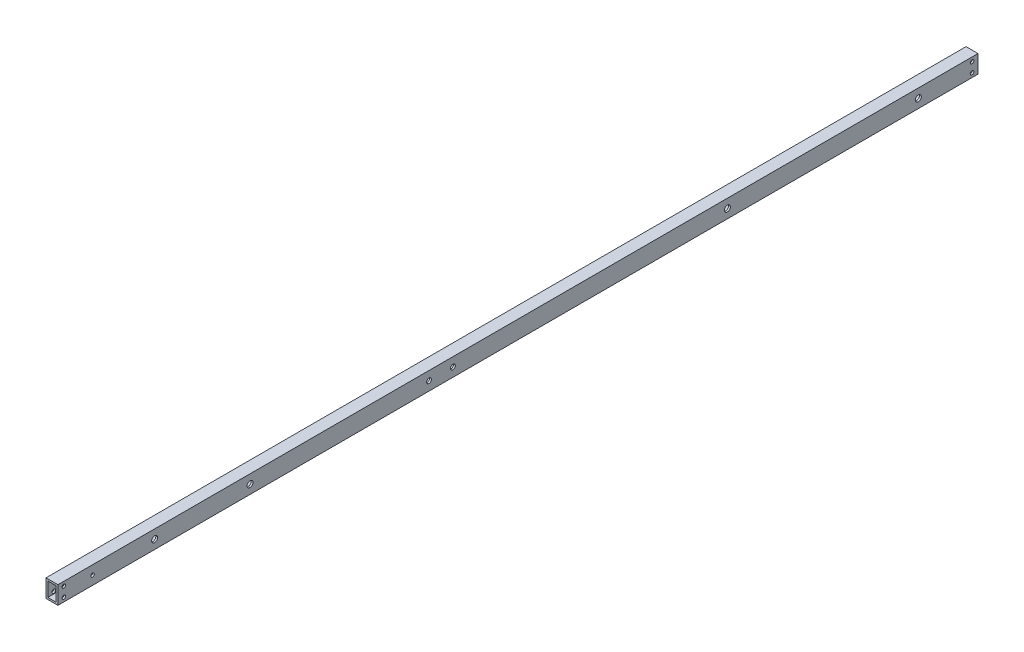
ISO-10303-21;
HEADER;
FILE_DESCRIPTION(('STEP AP214'),'2;1');
FILE_NAME('part.step','',(''),(''),'','','');
FILE_SCHEMA(('AUTOMOTIVE_DESIGN { 1 0 10303 214 1 1 1 1 }'));
ENDSEC;
DATA;
#1=APPLICATION_CONTEXT('core data for automotive mechanical design processes');
#2=APPLICATION_PROTOCOL_DEFINITION('international standard','automotive_design',2000,#1);
#3=PRODUCT_CONTEXT('',#1,'mechanical');
#4=PRODUCT('Part','Part','',(#3));
#5=PRODUCT_RELATED_PRODUCT_CATEGORY('part','',(#4));
#6=PRODUCT_DEFINITION_FORMATION('','',#4);
#7=PRODUCT_DEFINITION_CONTEXT('part definition',#1,'design');
#8=PRODUCT_DEFINITION('design','',#6,#7);
#9=PRODUCT_DEFINITION_SHAPE('','',#8);
#10=(LENGTH_UNIT() NAMED_UNIT(*) SI_UNIT(.MILLI.,.METRE.));
#11=(NAMED_UNIT(*) PLANE_ANGLE_UNIT() SI_UNIT($,.RADIAN.));
#12=(NAMED_UNIT(*) SI_UNIT($,.STERADIAN.) SOLID_ANGLE_UNIT());
#13=UNCERTAINTY_MEASURE_WITH_UNIT(LENGTH_MEASURE(1.E-05),#10,'distance_accuracy_value','');
#14=(GEOMETRIC_REPRESENTATION_CONTEXT(3) GLOBAL_UNCERTAINTY_ASSIGNED_CONTEXT((#13)) GLOBAL_UNIT_ASSIGNED_CONTEXT((#10,
#11,#12)) REPRESENTATION_CONTEXT('',''));
#15=CARTESIAN_POINT('',(0.,0.,0.));
#16=DIRECTION('',(0.,0.,1.));
#17=DIRECTION('',(1.,0.,0.));
#18=AXIS2_PLACEMENT_3D('',#15,#16,#17);
#19=CARTESIAN_POINT('',(0.,0.,771.));
#20=DIRECTION('',(0.,0.,1.));
#21=DIRECTION('',(1.,0.,0.));
#22=AXIS2_PLACEMENT_3D('',#19,#20,#21);
#23=PLANE('',#22);
#24=DIRECTION('',(0.,1.,0.));
#25=VECTOR('',#24,1.);
#26=CARTESIAN_POINT('',(5.,-7.5,771.));
#27=LINE('',#26,#25);
#28=CARTESIAN_POINT('',(5.,-7.5,771.));
#29=VERTEX_POINT('',#28);
#30=CARTESIAN_POINT('',(5.,7.5,771.));
#31=VERTEX_POINT('',#30);
#32=EDGE_CURVE('E181',#29,#31,#27,.T.);
#33=ORIENTED_EDGE('',*,*,#32,.T.);
#34=DIRECTION('',(-1.,0.,0.));
#35=VECTOR('',#34,1.);
#36=CARTESIAN_POINT('',(-5.,7.5,771.));
#37=LINE('',#36,#35);
#38=CARTESIAN_POINT('',(-5.,7.5,771.));
#39=VERTEX_POINT('',#38);
#40=EDGE_CURVE('E185',#31,#39,#37,.T.);
#41=ORIENTED_EDGE('',*,*,#40,.T.);
#42=DIRECTION('',(0.,-1.,0.));
#43=VECTOR('',#42,1.);
#44=CARTESIAN_POINT('',(-5.,-7.5,771.));
#45=LINE('',#44,#43);
#46=CARTESIAN_POINT('',(-5.,-7.5,771.));
#47=VERTEX_POINT('',#46);
#48=EDGE_CURVE('E189',#39,#47,#45,.T.);
#49=ORIENTED_EDGE('',*,*,#48,.T.);
#50=DIRECTION('',(1.,0.,0.));
#51=VECTOR('',#50,1.);
#52=CARTESIAN_POINT('',(-5.,-7.5,771.));
#53=LINE('',#52,#51);
#54=EDGE_CURVE('E192',#47,#29,#53,.T.);
#55=ORIENTED_EDGE('',*,*,#54,.T.);
#56=EDGE_LOOP('',(#33,#41,#49,#55));
#57=FACE_BOUND('',#56,.T.);
#58=DIRECTION('',(-1.,0.,0.));
#59=VECTOR('',#58,1.);
#60=CARTESIAN_POINT('',(0.,6.,771.));
#61=LINE('',#60,#59);
#62=CARTESIAN_POINT('',(3.5,6.,771.));
#63=VERTEX_POINT('',#62);
#64=CARTESIAN_POINT('',(-3.5,6.,771.));
#65=VERTEX_POINT('',#64);
#66=EDGE_CURVE('E140',#63,#65,#61,.T.);
#67=ORIENTED_EDGE('',*,*,#66,.F.);
#68=DIRECTION('',(0.,1.,0.));
#69=VECTOR('',#68,1.);
#70=CARTESIAN_POINT('',(3.5,0.,771.));
#71=LINE('',#70,#69);
#72=CARTESIAN_POINT('',(3.5,-6.,771.));
#73=VERTEX_POINT('',#72);
#74=EDGE_CURVE('E131',#73,#63,#71,.T.);
#75=ORIENTED_EDGE('',*,*,#74,.F.);
#76=DIRECTION('',(1.,0.,0.));
#77=VECTOR('',#76,1.);
#78=CARTESIAN_POINT('',(0.,-6.,771.));
#79=LINE('',#78,#77);
#80=CARTESIAN_POINT('',(-3.5,-6.,771.));
#81=VERTEX_POINT('',#80);
#82=EDGE_CURVE('E157',#81,#73,#79,.T.);
#83=ORIENTED_EDGE('',*,*,#82,.F.);
#84=DIRECTION('',(0.,-1.,0.));
#85=VECTOR('',#84,1.);
#86=CARTESIAN_POINT('',(-3.5,0.,771.));
#87=LINE('',#86,#85);
#88=EDGE_CURVE('E153',#65,#81,#87,.T.);
#89=ORIENTED_EDGE('',*,*,#88,.F.);
#90=EDGE_LOOP('',(#67,#75,#83,#89));
#91=FACE_BOUND('',#90,.T.);
#92=ADVANCED_FACE('F63',(#57,#91),#23,.T.);
#93=CARTESIAN_POINT('',(0.,0.,0.));
#94=DIRECTION('',(0.,0.,1.));
#95=DIRECTION('',(1.,0.,0.));
#96=AXIS2_PLACEMENT_3D('',#93,#94,#95);
#97=PLANE('',#96);
#98=DIRECTION('',(0.,1.,0.));
#99=VECTOR('',#98,1.);
#100=CARTESIAN_POINT('',(5.,-7.5,0.));
#101=LINE('',#100,#99);
#102=CARTESIAN_POINT('',(5.,-7.5,0.));
#103=VERTEX_POINT('',#102);
#104=CARTESIAN_POINT('',(5.,7.5,0.));
#105=VERTEX_POINT('',#104);
#106=EDGE_CURVE('E149',#103,#105,#101,.T.);
#107=ORIENTED_EDGE('',*,*,#106,.F.);
#108=DIRECTION('',(1.,0.,0.));
#109=VECTOR('',#108,1.);
#110=CARTESIAN_POINT('',(-5.,-7.5,0.));
#111=LINE('',#110,#109);
#112=CARTESIAN_POINT('',(-5.,-7.5,0.));
#113=VERTEX_POINT('',#112);
#114=EDGE_CURVE('E186',#113,#103,#111,.T.);
#115=ORIENTED_EDGE('',*,*,#114,.F.);
#116=DIRECTION('',(0.,-1.,0.));
#117=VECTOR('',#116,1.);
#118=CARTESIAN_POINT('',(-5.,-7.5,0.));
#119=LINE('',#118,#117);
#120=CARTESIAN_POINT('',(-5.,7.5,0.));
#121=VERTEX_POINT('',#120);
#122=EDGE_CURVE('E202',#121,#113,#119,.T.);
#123=ORIENTED_EDGE('',*,*,#122,.F.);
#124=DIRECTION('',(-1.,0.,0.));
#125=VECTOR('',#124,1.);
#126=CARTESIAN_POINT('',(-5.,7.5,0.));
#127=LINE('',#126,#125);
#128=EDGE_CURVE('E199',#105,#121,#127,.T.);
#129=ORIENTED_EDGE('',*,*,#128,.F.);
#130=EDGE_LOOP('',(#107,#115,#123,#129));
#131=FACE_BOUND('',#130,.T.);
#132=DIRECTION('',(0.,1.,0.));
#133=VECTOR('',#132,1.);
#134=CARTESIAN_POINT('',(3.5,0.,0.));
#135=LINE('',#134,#133);
#136=CARTESIAN_POINT('',(3.5,-6.,0.));
#137=VERTEX_POINT('',#136);
#138=CARTESIAN_POINT('',(3.5,6.,0.));
#139=VERTEX_POINT('',#138);
#140=EDGE_CURVE('E89',#137,#139,#135,.T.);
#141=ORIENTED_EDGE('',*,*,#140,.T.);
#142=DIRECTION('',(-1.,0.,0.));
#143=VECTOR('',#142,1.);
#144=CARTESIAN_POINT('',(0.,6.,0.));
#145=LINE('',#144,#143);
#146=CARTESIAN_POINT('',(-3.5,6.,0.));
#147=VERTEX_POINT('',#146);
#148=EDGE_CURVE('E147',#139,#147,#145,.T.);
#149=ORIENTED_EDGE('',*,*,#148,.T.);
#150=DIRECTION('',(0.,-1.,0.));
#151=VECTOR('',#150,1.);
#152=CARTESIAN_POINT('',(-3.5,0.,0.));
#153=LINE('',#152,#151);
#154=CARTESIAN_POINT('',(-3.5,-6.,0.));
#155=VERTEX_POINT('',#154);
#156=EDGE_CURVE('E168',#147,#155,#153,.T.);
#157=ORIENTED_EDGE('',*,*,#156,.T.);
#158=DIRECTION('',(1.,0.,0.));
#159=VECTOR('',#158,1.);
#160=CARTESIAN_POINT('',(0.,-6.,0.));
#161=LINE('',#160,#159);
#162=EDGE_CURVE('E141',#155,#137,#161,.T.);
#163=ORIENTED_EDGE('',*,*,#162,.T.);
#164=EDGE_LOOP('',(#141,#149,#157,#163));
#165=FACE_BOUND('',#164,.T.);
#166=ADVANCED_FACE('F468',(#131,#165),#97,.F.);
#167=CARTESIAN_POINT('',(5.,-7.5,771.));
#168=DIRECTION('',(-1.,0.,0.));
#169=DIRECTION('',(0.,0.,1.));
#170=AXIS2_PLACEMENT_3D('',#167,#168,#169);
#171=PLANE('',#170);
#172=CARTESIAN_POINT('',(5.,0.,460.));
#173=DIRECTION('',(1.,0.,0.));
#174=DIRECTION('',(0.,0.,1.));
#175=AXIS2_PLACEMENT_3D('',#172,#173,#174);
#176=CIRCLE('',#175,2.);
#177=CARTESIAN_POINT('',(5.,0.,462.));
#178=VERTEX_POINT('',#177);
#179=EDGE_CURVE('E378',#178,#178,#176,.T.);
#180=ORIENTED_EDGE('',*,*,#179,.F.);
#181=EDGE_LOOP('',(#180));
#182=FACE_BOUND('',#181,.T.);
#183=CARTESIAN_POINT('',(5.,0.,440.));
#184=DIRECTION('',(1.,0.,0.));
#185=DIRECTION('',(0.,0.,-1.));
#186=AXIS2_PLACEMENT_3D('',#183,#184,#185);
#187=CIRCLE('',#186,2.);
#188=CARTESIAN_POINT('',(5.,0.,438.));
#189=VERTEX_POINT('',#188);
#190=EDGE_CURVE('E382',#189,#189,#187,.T.);
#191=ORIENTED_EDGE('',*,*,#190,.F.);
#192=EDGE_LOOP('',(#191));
#193=FACE_BOUND('',#192,.T.);
#194=CARTESIAN_POINT('',(5.,0.,690.));
#195=DIRECTION('',(1.,0.,0.));
#196=DIRECTION('',(0.,0.,-1.));
#197=AXIS2_PLACEMENT_3D('',#194,#195,#196);
#198=CIRCLE('',#197,2.50000000000003);
#199=CARTESIAN_POINT('',(5.,0.,687.5));
#200=VERTEX_POINT('',#199);
#201=EDGE_CURVE('E387',#200,#200,#198,.T.);
#202=ORIENTED_EDGE('',*,*,#201,.F.);
#203=EDGE_LOOP('',(#202));
#204=FACE_BOUND('',#203,.T.);
#205=CARTESIAN_POINT('',(5.,0.,742.));
#206=DIRECTION('',(1.,0.,0.));
#207=DIRECTION('',(0.,0.,-1.));
#208=AXIS2_PLACEMENT_3D('',#205,#206,#207);
#209=CIRCLE('',#208,1.49999999999997);
#210=CARTESIAN_POINT('',(5.,0.,740.5));
#211=VERTEX_POINT('',#210);
#212=EDGE_CURVE('E395',#211,#211,#209,.T.);
#213=ORIENTED_EDGE('',*,*,#212,.F.);
#214=EDGE_LOOP('',(#213));
#215=FACE_BOUND('',#214,.T.);
#216=CARTESIAN_POINT('',(5.,0.,50.));
#217=DIRECTION('',(1.,0.,0.));
#218=DIRECTION('',(0.,0.,-1.));
#219=AXIS2_PLACEMENT_3D('',#216,#217,#218);
#220=CIRCLE('',#219,2.5);
#221=CARTESIAN_POINT('',(5.,0.,47.5));
#222=VERTEX_POINT('',#221);
#223=EDGE_CURVE('E357',#222,#222,#220,.T.);
#224=ORIENTED_EDGE('',*,*,#223,.F.);
#225=EDGE_LOOP('',(#224));
#226=FACE_BOUND('',#225,.T.);
#227=CARTESIAN_POINT('',(5.,-4.,766.));
#228=DIRECTION('',(1.,0.,0.));
#229=DIRECTION('',(0.,0.,1.));
#230=AXIS2_PLACEMENT_3D('',#227,#228,#229);
#231=CIRCLE('',#230,1.49999999999997);
#232=CARTESIAN_POINT('',(5.,-4.,767.5));
#233=VERTEX_POINT('',#232);
#234=EDGE_CURVE('E346',#233,#233,#231,.T.);
#235=ORIENTED_EDGE('',*,*,#234,.F.);
#236=EDGE_LOOP('',(#235));
#237=FACE_BOUND('',#236,.T.);
#238=CARTESIAN_POINT('',(5.,-4.,5.));
#239=DIRECTION('',(1.,0.,0.));
#240=DIRECTION('',(0.,0.,1.));
#241=AXIS2_PLACEMENT_3D('',#238,#239,#240);
#242=CIRCLE('',#241,1.5);
#243=CARTESIAN_POINT('',(5.,-4.,6.5));
#244=VERTEX_POINT('',#243);
#245=EDGE_CURVE('E334',#244,#244,#242,.T.);
#246=ORIENTED_EDGE('',*,*,#245,.F.);
#247=EDGE_LOOP('',(#246));
#248=FACE_BOUND('',#247,.T.);
#249=CARTESIAN_POINT('',(5.,4.,5.));
#250=DIRECTION('',(1.,0.,0.));
#251=DIRECTION('',(0.,0.,-1.));
#252=AXIS2_PLACEMENT_3D('',#249,#250,#251);
#253=CIRCLE('',#252,1.5);
#254=CARTESIAN_POINT('',(5.,4.,3.5));
#255=VERTEX_POINT('',#254);
#256=EDGE_CURVE('E343',#255,#255,#253,.T.);
#257=ORIENTED_EDGE('',*,*,#256,.F.);
#258=EDGE_LOOP('',(#257));
#259=FACE_BOUND('',#258,.T.);
#260=CARTESIAN_POINT('',(5.,0.,610.));
#261=DIRECTION('',(1.,0.,0.));
#262=DIRECTION('',(0.,0.,-1.));
#263=AXIS2_PLACEMENT_3D('',#260,#261,#262);
#264=CIRCLE('',#263,2.50000000000003);
#265=CARTESIAN_POINT('',(5.,0.,607.5));
#266=VERTEX_POINT('',#265);
#267=EDGE_CURVE('E411',#266,#266,#264,.T.);
#268=ORIENTED_EDGE('',*,*,#267,.F.);
#269=EDGE_LOOP('',(#268));
#270=FACE_BOUND('',#269,.T.);
#271=CARTESIAN_POINT('',(5.,0.,210.));
#272=DIRECTION('',(1.,0.,0.));
#273=DIRECTION('',(0.,0.,-1.));
#274=AXIS2_PLACEMENT_3D('',#271,#272,#273);
#275=CIRCLE('',#274,2.5);
#276=CARTESIAN_POINT('',(5.,0.,207.5));
#277=VERTEX_POINT('',#276);
#278=EDGE_CURVE('E402',#277,#277,#275,.T.);
#279=ORIENTED_EDGE('',*,*,#278,.F.);
#280=EDGE_LOOP('',(#279));
#281=FACE_BOUND('',#280,.T.);
#282=CARTESIAN_POINT('',(5.,4.,766.));
#283=DIRECTION('',(1.,0.,0.));
#284=DIRECTION('',(0.,0.,-1.));
#285=AXIS2_PLACEMENT_3D('',#282,#283,#284);
#286=CIRCLE('',#285,1.49999999999997);
#287=CARTESIAN_POINT('',(5.,4.,764.5));
#288=VERTEX_POINT('',#287);
#289=EDGE_CURVE('E316',#288,#288,#286,.T.);
#290=ORIENTED_EDGE('',*,*,#289,.F.);
#291=EDGE_LOOP('',(#290));
#292=FACE_BOUND('',#291,.T.);
#293=ORIENTED_EDGE('',*,*,#106,.T.);
#294=DIRECTION('',(0.,0.,-1.));
#295=VECTOR('',#294,1.);
#296=CARTESIAN_POINT('',(5.,7.5,771.));
#297=LINE('',#296,#295);
#298=EDGE_CURVE('E12',#31,#105,#297,.T.);
#299=ORIENTED_EDGE('',*,*,#298,.F.);
#300=ORIENTED_EDGE('',*,*,#32,.F.);
#301=DIRECTION('',(0.,0.,-1.));
#302=VECTOR('',#301,1.);
#303=CARTESIAN_POINT('',(5.,-7.5,771.));
#304=LINE('',#303,#302);
#305=EDGE_CURVE('E195',#29,#103,#304,.T.);
#306=ORIENTED_EDGE('',*,*,#305,.T.);
#307=EDGE_LOOP('',(#293,#299,#300,#306));
#308=FACE_BOUND('',#307,.T.);
#309=ADVANCED_FACE('F65',(#182,#193,#204,#215,#226,#237,#248,#259,#270,#281,#292,#308),#171,.F.);
#310=CARTESIAN_POINT('',(-5.,7.5,771.));
#311=DIRECTION('',(0.,-1.,0.));
#312=DIRECTION('',(0.,0.,-1.));
#313=AXIS2_PLACEMENT_3D('',#310,#311,#312);
#314=PLANE('',#313);
#315=ORIENTED_EDGE('',*,*,#128,.T.);
#316=DIRECTION('',(0.,0.,-1.));
#317=VECTOR('',#316,1.);
#318=CARTESIAN_POINT('',(-5.,7.5,771.));
#319=LINE('',#318,#317);
#320=EDGE_CURVE('E73',#39,#121,#319,.T.);
#321=ORIENTED_EDGE('',*,*,#320,.F.);
#322=ORIENTED_EDGE('',*,*,#40,.F.);
#323=ORIENTED_EDGE('',*,*,#298,.T.);
#324=EDGE_LOOP('',(#315,#321,#322,#323));
#325=FACE_BOUND('',#324,.T.);
#326=ADVANCED_FACE('F440',(#325),#314,.F.);
#327=CARTESIAN_POINT('',(-5.,-7.5,771.));
#328=DIRECTION('',(1.,0.,0.));
#329=DIRECTION('',(0.,0.,-1.));
#330=AXIS2_PLACEMENT_3D('',#327,#328,#329);
#331=PLANE('',#330);
#332=CARTESIAN_POINT('',(-5.,0.,440.));
#333=DIRECTION('',(-1.,0.,0.));
#334=DIRECTION('',(0.,0.,1.));
#335=AXIS2_PLACEMENT_3D('',#332,#333,#334);
#336=CIRCLE('',#335,3.99999999999999);
#337=CARTESIAN_POINT('',(-5.,0.,444.));
#338=VERTEX_POINT('',#337);
#339=EDGE_CURVE('E422',#338,#338,#336,.T.);
#340=ORIENTED_EDGE('',*,*,#339,.F.);
#341=EDGE_LOOP('',(#340));
#342=FACE_BOUND('',#341,.T.);
#343=CARTESIAN_POINT('',(-5.,0.,460.));
#344=DIRECTION('',(-1.,0.,0.));
#345=DIRECTION('',(0.,0.,1.));
#346=AXIS2_PLACEMENT_3D('',#343,#344,#345);
#347=CIRCLE('',#346,3.99999999999999);
#348=CARTESIAN_POINT('',(-5.,0.,464.));
#349=VERTEX_POINT('',#348);
#350=EDGE_CURVE('E423',#349,#349,#347,.T.);
#351=ORIENTED_EDGE('',*,*,#350,.F.);
#352=EDGE_LOOP('',(#351));
#353=FACE_BOUND('',#352,.T.);
#354=CARTESIAN_POINT('',(-5.,0.,690.));
#355=DIRECTION('',(1.,0.,0.));
#356=DIRECTION('',(0.,0.,-1.));
#357=AXIS2_PLACEMENT_3D('',#354,#355,#356);
#358=CIRCLE('',#357,2.50000000000003);
#359=CARTESIAN_POINT('',(-5.,0.,687.5));
#360=VERTEX_POINT('',#359);
#361=EDGE_CURVE('E391',#360,#360,#358,.T.);
#362=ORIENTED_EDGE('',*,*,#361,.T.);
#363=EDGE_LOOP('',(#362));
#364=FACE_BOUND('',#363,.T.);
#365=CARTESIAN_POINT('',(-5.,0.,742.));
#366=DIRECTION('',(1.,0.,0.));
#367=DIRECTION('',(0.,0.,-1.));
#368=AXIS2_PLACEMENT_3D('',#365,#366,#367);
#369=CIRCLE('',#368,1.49999999999997);
#370=CARTESIAN_POINT('',(-5.,0.,740.5));
#371=VERTEX_POINT('',#370);
#372=EDGE_CURVE('E360',#371,#371,#369,.T.);
#373=ORIENTED_EDGE('',*,*,#372,.T.);
#374=EDGE_LOOP('',(#373));
#375=FACE_BOUND('',#374,.T.);
#376=CARTESIAN_POINT('',(-5.,0.,50.));
#377=DIRECTION('',(1.,0.,0.));
#378=DIRECTION('',(0.,0.,-1.));
#379=AXIS2_PLACEMENT_3D('',#376,#377,#378);
#380=CIRCLE('',#379,2.5);
#381=CARTESIAN_POINT('',(-5.,0.,47.5));
#382=VERTEX_POINT('',#381);
#383=EDGE_CURVE('E353',#382,#382,#380,.T.);
#384=ORIENTED_EDGE('',*,*,#383,.T.);
#385=EDGE_LOOP('',(#384));
#386=FACE_BOUND('',#385,.T.);
#387=CARTESIAN_POINT('',(-5.,-4.,766.));
#388=DIRECTION('',(1.,0.,0.));
#389=DIRECTION('',(0.,0.,1.));
#390=AXIS2_PLACEMENT_3D('',#387,#388,#389);
#391=CIRCLE('',#390,1.49999999999997);
#392=CARTESIAN_POINT('',(-5.,-4.,767.5));
#393=VERTEX_POINT('',#392);
#394=EDGE_CURVE('E338',#393,#393,#391,.T.);
#395=ORIENTED_EDGE('',*,*,#394,.T.);
#396=EDGE_LOOP('',(#395));
#397=FACE_BOUND('',#396,.T.);
#398=CARTESIAN_POINT('',(-5.,-4.,5.));
#399=DIRECTION('',(1.,0.,0.));
#400=DIRECTION('',(0.,0.,1.));
#401=AXIS2_PLACEMENT_3D('',#398,#399,#400);
#402=CIRCLE('',#401,1.5);
#403=CARTESIAN_POINT('',(-5.,-4.,6.5));
#404=VERTEX_POINT('',#403);
#405=EDGE_CURVE('E337',#404,#404,#402,.T.);
#406=ORIENTED_EDGE('',*,*,#405,.T.);
#407=EDGE_LOOP('',(#406));
#408=FACE_BOUND('',#407,.T.);
#409=CARTESIAN_POINT('',(-5.,4.,5.));
#410=DIRECTION('',(1.,0.,0.));
#411=DIRECTION('',(0.,0.,-1.));
#412=AXIS2_PLACEMENT_3D('',#409,#410,#411);
#413=CIRCLE('',#412,1.5);
#414=CARTESIAN_POINT('',(-5.,4.,3.5));
#415=VERTEX_POINT('',#414);
#416=EDGE_CURVE('E367',#415,#415,#413,.T.);
#417=ORIENTED_EDGE('',*,*,#416,.T.);
#418=EDGE_LOOP('',(#417));
#419=FACE_BOUND('',#418,.T.);
#420=CARTESIAN_POINT('',(-5.,0.,610.));
#421=DIRECTION('',(1.,0.,0.));
#422=DIRECTION('',(0.,0.,-1.));
#423=AXIS2_PLACEMENT_3D('',#420,#421,#422);
#424=CIRCLE('',#423,2.50000000000003);
#425=CARTESIAN_POINT('',(-5.,0.,607.5));
#426=VERTEX_POINT('',#425);
#427=EDGE_CURVE('E383',#426,#426,#424,.T.);
#428=ORIENTED_EDGE('',*,*,#427,.T.);
#429=EDGE_LOOP('',(#428));
#430=FACE_BOUND('',#429,.T.);
#431=CARTESIAN_POINT('',(-5.,0.,210.));
#432=DIRECTION('',(1.,0.,0.));
#433=DIRECTION('',(0.,0.,-1.));
#434=AXIS2_PLACEMENT_3D('',#431,#432,#433);
#435=CIRCLE('',#434,2.5);
#436=CARTESIAN_POINT('',(-5.,0.,207.5));
#437=VERTEX_POINT('',#436);
#438=EDGE_CURVE('E406',#437,#437,#435,.T.);
#439=ORIENTED_EDGE('',*,*,#438,.T.);
#440=EDGE_LOOP('',(#439));
#441=FACE_BOUND('',#440,.T.);
#442=CARTESIAN_POINT('',(-5.,4.,766.));
#443=DIRECTION('',(1.,0.,0.));
#444=DIRECTION('',(0.,0.,-1.));
#445=AXIS2_PLACEMENT_3D('',#442,#443,#444);
#446=CIRCLE('',#445,1.49999999999997);
#447=CARTESIAN_POINT('',(-5.,4.,764.5));
#448=VERTEX_POINT('',#447);
#449=EDGE_CURVE('E222',#448,#448,#446,.T.);
#450=ORIENTED_EDGE('',*,*,#449,.T.);
#451=EDGE_LOOP('',(#450));
#452=FACE_BOUND('',#451,.T.);
#453=ORIENTED_EDGE('',*,*,#122,.T.);
#454=DIRECTION('',(0.,0.,-1.));
#455=VECTOR('',#454,1.);
#456=CARTESIAN_POINT('',(-5.,-7.5,771.));
#457=LINE('',#456,#455);
#458=EDGE_CURVE('E210',#47,#113,#457,.T.);
#459=ORIENTED_EDGE('',*,*,#458,.F.);
#460=ORIENTED_EDGE('',*,*,#48,.F.);
#461=ORIENTED_EDGE('',*,*,#320,.T.);
#462=EDGE_LOOP('',(#453,#459,#460,#461));
#463=FACE_BOUND('',#462,.T.);
#464=ADVANCED_FACE('F437',(#342,#353,#364,#375,#386,#397,#408,#419,#430,#441,#452,#463),#331,.F.);
#465=CARTESIAN_POINT('',(-5.,-7.5,771.));
#466=DIRECTION('',(0.,1.,0.));
#467=DIRECTION('',(0.,0.,1.));
#468=AXIS2_PLACEMENT_3D('',#465,#466,#467);
#469=PLANE('',#468);
#470=ORIENTED_EDGE('',*,*,#114,.T.);
#471=ORIENTED_EDGE('',*,*,#305,.F.);
#472=ORIENTED_EDGE('',*,*,#54,.F.);
#473=ORIENTED_EDGE('',*,*,#458,.T.);
#474=EDGE_LOOP('',(#470,#471,#472,#473));
#475=FACE_BOUND('',#474,.T.);
#476=ADVANCED_FACE('F285',(#475),#469,.F.);
#477=CARTESIAN_POINT('',(3.5,0.,771.));
#478=DIRECTION('',(-1.,0.,0.));
#479=DIRECTION('',(0.,0.,1.));
#480=AXIS2_PLACEMENT_3D('',#477,#478,#479);
#481=PLANE('',#480);
#482=CARTESIAN_POINT('',(3.5,0.,460.));
#483=DIRECTION('',(-1.,0.,0.));
#484=DIRECTION('',(0.,0.,1.));
#485=AXIS2_PLACEMENT_3D('',#482,#483,#484);
#486=CIRCLE('',#485,2.);
#487=CARTESIAN_POINT('',(3.5,0.,462.));
#488=VERTEX_POINT('',#487);
#489=EDGE_CURVE('E165',#488,#488,#486,.T.);
#490=ORIENTED_EDGE('',*,*,#489,.F.);
#491=EDGE_LOOP('',(#490));
#492=FACE_BOUND('',#491,.T.);
#493=CARTESIAN_POINT('',(3.5,0.,440.));
#494=DIRECTION('',(-1.,0.,0.));
#495=DIRECTION('',(0.,0.,1.));
#496=AXIS2_PLACEMENT_3D('',#493,#494,#495);
#497=CIRCLE('',#496,2.);
#498=CARTESIAN_POINT('',(3.5,0.,442.));
#499=VERTEX_POINT('',#498);
#500=EDGE_CURVE('E273',#499,#499,#497,.T.);
#501=ORIENTED_EDGE('',*,*,#500,.F.);
#502=EDGE_LOOP('',(#501));
#503=FACE_BOUND('',#502,.T.);
#504=CARTESIAN_POINT('',(3.5,0.,690.));
#505=DIRECTION('',(-1.,0.,0.));
#506=DIRECTION('',(0.,0.,1.));
#507=AXIS2_PLACEMENT_3D('',#504,#505,#506);
#508=CIRCLE('',#507,2.50000000000003);
#509=CARTESIAN_POINT('',(3.5,0.,692.5));
#510=VERTEX_POINT('',#509);
#511=EDGE_CURVE('E269',#510,#510,#508,.T.);
#512=ORIENTED_EDGE('',*,*,#511,.F.);
#513=EDGE_LOOP('',(#512));
#514=FACE_BOUND('',#513,.T.);
#515=CARTESIAN_POINT('',(3.5,0.,742.));
#516=DIRECTION('',(-1.,0.,0.));
#517=DIRECTION('',(0.,0.,1.));
#518=AXIS2_PLACEMENT_3D('',#515,#516,#517);
#519=CIRCLE('',#518,1.49999999999997);
#520=CARTESIAN_POINT('',(3.5,0.,743.5));
#521=VERTEX_POINT('',#520);
#522=EDGE_CURVE('E255',#521,#521,#519,.T.);
#523=ORIENTED_EDGE('',*,*,#522,.F.);
#524=EDGE_LOOP('',(#523));
#525=FACE_BOUND('',#524,.T.);
#526=CARTESIAN_POINT('',(3.5,0.,50.));
#527=DIRECTION('',(-1.,0.,0.));
#528=DIRECTION('',(0.,0.,1.));
#529=AXIS2_PLACEMENT_3D('',#526,#527,#528);
#530=CIRCLE('',#529,2.5);
#531=CARTESIAN_POINT('',(3.5,0.,52.5));
#532=VERTEX_POINT('',#531);
#533=EDGE_CURVE('E251',#532,#532,#530,.T.);
#534=ORIENTED_EDGE('',*,*,#533,.F.);
#535=EDGE_LOOP('',(#534));
#536=FACE_BOUND('',#535,.T.);
#537=CARTESIAN_POINT('',(3.5,-4.,766.));
#538=DIRECTION('',(-1.,0.,0.));
#539=DIRECTION('',(0.,0.,1.));
#540=AXIS2_PLACEMENT_3D('',#537,#538,#539);
#541=CIRCLE('',#540,1.49999999999997);
#542=CARTESIAN_POINT('',(3.5,-4.,767.5));
#543=VERTEX_POINT('',#542);
#544=EDGE_CURVE('E247',#543,#543,#541,.T.);
#545=ORIENTED_EDGE('',*,*,#544,.F.);
#546=EDGE_LOOP('',(#545));
#547=FACE_BOUND('',#546,.T.);
#548=CARTESIAN_POINT('',(3.5,-4.,5.));
#549=DIRECTION('',(-1.,0.,0.));
#550=DIRECTION('',(0.,0.,1.));
#551=AXIS2_PLACEMENT_3D('',#548,#549,#550);
#552=CIRCLE('',#551,1.5);
#553=CARTESIAN_POINT('',(3.5,-4.,6.5));
#554=VERTEX_POINT('',#553);
#555=EDGE_CURVE('E242',#554,#554,#552,.T.);
#556=ORIENTED_EDGE('',*,*,#555,.F.);
#557=EDGE_LOOP('',(#556));
#558=FACE_BOUND('',#557,.T.);
#559=CARTESIAN_POINT('',(3.5,4.,5.));
#560=DIRECTION('',(-1.,0.,0.));
#561=DIRECTION('',(0.,0.,1.));
#562=AXIS2_PLACEMENT_3D('',#559,#560,#561);
#563=CIRCLE('',#562,1.5);
#564=CARTESIAN_POINT('',(3.5,4.,6.50000000000001));
#565=VERTEX_POINT('',#564);
#566=EDGE_CURVE('E237',#565,#565,#563,.T.);
#567=ORIENTED_EDGE('',*,*,#566,.F.);
#568=EDGE_LOOP('',(#567));
#569=FACE_BOUND('',#568,.T.);
#570=CARTESIAN_POINT('',(3.5,0.,610.));
#571=DIRECTION('',(-1.,0.,0.));
#572=DIRECTION('',(0.,0.,1.));
#573=AXIS2_PLACEMENT_3D('',#570,#571,#572);
#574=CIRCLE('',#573,2.50000000000003);
#575=CARTESIAN_POINT('',(3.5,0.,612.5));
#576=VERTEX_POINT('',#575);
#577=EDGE_CURVE('E232',#576,#576,#574,.T.);
#578=ORIENTED_EDGE('',*,*,#577,.F.);
#579=EDGE_LOOP('',(#578));
#580=FACE_BOUND('',#579,.T.);
#581=CARTESIAN_POINT('',(3.5,0.,210.));
#582=DIRECTION('',(-1.,0.,0.));
#583=DIRECTION('',(0.,0.,1.));
#584=AXIS2_PLACEMENT_3D('',#581,#582,#583);
#585=CIRCLE('',#584,2.5);
#586=CARTESIAN_POINT('',(3.5,0.,212.5));
#587=VERTEX_POINT('',#586);
#588=EDGE_CURVE('E227',#587,#587,#585,.T.);
#589=ORIENTED_EDGE('',*,*,#588,.F.);
#590=EDGE_LOOP('',(#589));
#591=FACE_BOUND('',#590,.T.);
#592=CARTESIAN_POINT('',(3.5,4.,766.));
#593=DIRECTION('',(-1.,0.,0.));
#594=DIRECTION('',(0.,0.,1.));
#595=AXIS2_PLACEMENT_3D('',#592,#593,#594);
#596=CIRCLE('',#595,1.49999999999997);
#597=CARTESIAN_POINT('',(3.5,4.,767.5));
#598=VERTEX_POINT('',#597);
#599=EDGE_CURVE('E221',#598,#598,#596,.T.);
#600=ORIENTED_EDGE('',*,*,#599,.F.);
#601=EDGE_LOOP('',(#600));
#602=FACE_BOUND('',#601,.T.);
#603=ORIENTED_EDGE('',*,*,#140,.F.);
#604=DIRECTION('',(0.,0.,-1.));
#605=VECTOR('',#604,1.);
#606=CARTESIAN_POINT('',(3.5,-6.,771.));
#607=LINE('',#606,#605);
#608=EDGE_CURVE('E135',#73,#137,#607,.T.);
#609=ORIENTED_EDGE('',*,*,#608,.F.);
#610=ORIENTED_EDGE('',*,*,#74,.T.);
#611=DIRECTION('',(0.,0.,-1.));
#612=VECTOR('',#611,1.);
#613=CARTESIAN_POINT('',(3.5,6.,771.));
#614=LINE('',#613,#612);
#615=EDGE_CURVE('E134',#63,#139,#614,.T.);
#616=ORIENTED_EDGE('',*,*,#615,.T.);
#617=EDGE_LOOP('',(#603,#609,#610,#616));
#618=FACE_BOUND('',#617,.T.);
#619=ADVANCED_FACE('F133',(#492,#503,#514,#525,#536,#547,#558,#569,#580,#591,#602,#618),#481,.T.);
#620=CARTESIAN_POINT('',(0.,6.,771.));
#621=DIRECTION('',(0.,-1.,0.));
#622=DIRECTION('',(0.,0.,-1.));
#623=AXIS2_PLACEMENT_3D('',#620,#621,#622);
#624=PLANE('',#623);
#625=ORIENTED_EDGE('',*,*,#148,.F.);
#626=ORIENTED_EDGE('',*,*,#615,.F.);
#627=ORIENTED_EDGE('',*,*,#66,.T.);
#628=DIRECTION('',(0.,0.,-1.));
#629=VECTOR('',#628,1.);
#630=CARTESIAN_POINT('',(-3.5,6.,771.));
#631=LINE('',#630,#629);
#632=EDGE_CURVE('E150',#65,#147,#631,.T.);
#633=ORIENTED_EDGE('',*,*,#632,.T.);
#634=EDGE_LOOP('',(#625,#626,#627,#633));
#635=FACE_BOUND('',#634,.T.);
#636=ADVANCED_FACE('F144',(#635),#624,.T.);
#637=CARTESIAN_POINT('',(-3.5,0.,771.));
#638=DIRECTION('',(1.,0.,0.));
#639=DIRECTION('',(0.,0.,-1.));
#640=AXIS2_PLACEMENT_3D('',#637,#638,#639);
#641=PLANE('',#640);
#642=CARTESIAN_POINT('',(-3.5,0.,440.));
#643=DIRECTION('',(1.,0.,0.));
#644=DIRECTION('',(0.,0.,-1.));
#645=AXIS2_PLACEMENT_3D('',#642,#643,#644);
#646=CIRCLE('',#645,3.99999999999999);
#647=CARTESIAN_POINT('',(-3.5,0.,436.));
#648=VERTEX_POINT('',#647);
#649=EDGE_CURVE('E407',#648,#648,#646,.F.);
#650=ORIENTED_EDGE('',*,*,#649,.T.);
#651=EDGE_LOOP('',(#650));
#652=FACE_BOUND('',#651,.T.);
#653=CARTESIAN_POINT('',(-3.5,0.,460.));
#654=DIRECTION('',(1.,0.,0.));
#655=DIRECTION('',(0.,0.,-1.));
#656=AXIS2_PLACEMENT_3D('',#653,#654,#655);
#657=CIRCLE('',#656,3.99999999999999);
#658=CARTESIAN_POINT('',(-3.5,0.,456.));
#659=VERTEX_POINT('',#658);
#660=EDGE_CURVE('E418',#659,#659,#657,.F.);
#661=ORIENTED_EDGE('',*,*,#660,.T.);
#662=EDGE_LOOP('',(#661));
#663=FACE_BOUND('',#662,.T.);
#664=CARTESIAN_POINT('',(-3.5,0.,690.));
#665=DIRECTION('',(1.,0.,0.));
#666=DIRECTION('',(0.,0.,-1.));
#667=AXIS2_PLACEMENT_3D('',#664,#665,#666);
#668=CIRCLE('',#667,2.50000000000003);
#669=CARTESIAN_POINT('',(-3.5,0.,687.5));
#670=VERTEX_POINT('',#669);
#671=EDGE_CURVE('E67',#670,#670,#668,.T.);
#672=ORIENTED_EDGE('',*,*,#671,.F.);
#673=EDGE_LOOP('',(#672));
#674=FACE_BOUND('',#673,.T.);
#675=CARTESIAN_POINT('',(-3.5,0.,742.));
#676=DIRECTION('',(1.,0.,0.));
#677=DIRECTION('',(0.,0.,-1.));
#678=AXIS2_PLACEMENT_3D('',#675,#676,#677);
#679=CIRCLE('',#678,1.49999999999997);
#680=CARTESIAN_POINT('',(-3.5,0.,740.5));
#681=VERTEX_POINT('',#680);
#682=EDGE_CURVE('E252',#681,#681,#679,.T.);
#683=ORIENTED_EDGE('',*,*,#682,.F.);
#684=EDGE_LOOP('',(#683));
#685=FACE_BOUND('',#684,.T.);
#686=CARTESIAN_POINT('',(-3.5,0.,50.));
#687=DIRECTION('',(1.,0.,0.));
#688=DIRECTION('',(0.,0.,-1.));
#689=AXIS2_PLACEMENT_3D('',#686,#687,#688);
#690=CIRCLE('',#689,2.5);
#691=CARTESIAN_POINT('',(-3.5,0.,47.5));
#692=VERTEX_POINT('',#691);
#693=EDGE_CURVE('E248',#692,#692,#690,.T.);
#694=ORIENTED_EDGE('',*,*,#693,.F.);
#695=EDGE_LOOP('',(#694));
#696=FACE_BOUND('',#695,.T.);
#697=CARTESIAN_POINT('',(-3.5,-4.,766.));
#698=DIRECTION('',(1.,0.,0.));
#699=DIRECTION('',(0.,0.,-1.));
#700=AXIS2_PLACEMENT_3D('',#697,#698,#699);
#701=CIRCLE('',#700,1.49999999999997);
#702=CARTESIAN_POINT('',(-3.5,-4.,764.5));
#703=VERTEX_POINT('',#702);
#704=EDGE_CURVE('E243',#703,#703,#701,.T.);
#705=ORIENTED_EDGE('',*,*,#704,.F.);
#706=EDGE_LOOP('',(#705));
#707=FACE_BOUND('',#706,.T.);
#708=CARTESIAN_POINT('',(-3.5,-4.,5.));
#709=DIRECTION('',(1.,0.,0.));
#710=DIRECTION('',(0.,0.,-1.));
#711=AXIS2_PLACEMENT_3D('',#708,#709,#710);
#712=CIRCLE('',#711,1.5);
#713=CARTESIAN_POINT('',(-3.5,-4.,3.5));
#714=VERTEX_POINT('',#713);
#715=EDGE_CURVE('E238',#714,#714,#712,.T.);
#716=ORIENTED_EDGE('',*,*,#715,.F.);
#717=EDGE_LOOP('',(#716));
#718=FACE_BOUND('',#717,.T.);
#719=CARTESIAN_POINT('',(-3.5,4.,5.));
#720=DIRECTION('',(1.,0.,0.));
#721=DIRECTION('',(0.,0.,-1.));
#722=AXIS2_PLACEMENT_3D('',#719,#720,#721);
#723=CIRCLE('',#722,1.5);
#724=CARTESIAN_POINT('',(-3.5,4.,3.5));
#725=VERTEX_POINT('',#724);
#726=EDGE_CURVE('E233',#725,#725,#723,.T.);
#727=ORIENTED_EDGE('',*,*,#726,.F.);
#728=EDGE_LOOP('',(#727));
#729=FACE_BOUND('',#728,.T.);
#730=CARTESIAN_POINT('',(-3.5,0.,610.));
#731=DIRECTION('',(1.,0.,0.));
#732=DIRECTION('',(0.,0.,-1.));
#733=AXIS2_PLACEMENT_3D('',#730,#731,#732);
#734=CIRCLE('',#733,2.50000000000003);
#735=CARTESIAN_POINT('',(-3.5,0.,607.5));
#736=VERTEX_POINT('',#735);
#737=EDGE_CURVE('E228',#736,#736,#734,.T.);
#738=ORIENTED_EDGE('',*,*,#737,.F.);
#739=EDGE_LOOP('',(#738));
#740=FACE_BOUND('',#739,.T.);
#741=CARTESIAN_POINT('',(-3.5,0.,210.));
#742=DIRECTION('',(1.,0.,0.));
#743=DIRECTION('',(0.,0.,-1.));
#744=AXIS2_PLACEMENT_3D('',#741,#742,#743);
#745=CIRCLE('',#744,2.5);
#746=CARTESIAN_POINT('',(-3.5,0.,207.5));
#747=VERTEX_POINT('',#746);
#748=EDGE_CURVE('E223',#747,#747,#745,.T.);
#749=ORIENTED_EDGE('',*,*,#748,.F.);
#750=EDGE_LOOP('',(#749));
#751=FACE_BOUND('',#750,.T.);
#752=CARTESIAN_POINT('',(-3.5,4.,766.));
#753=DIRECTION('',(1.,0.,0.));
#754=DIRECTION('',(0.,0.,-1.));
#755=AXIS2_PLACEMENT_3D('',#752,#753,#754);
#756=CIRCLE('',#755,1.49999999999997);
#757=CARTESIAN_POINT('',(-3.5,4.,764.5));
#758=VERTEX_POINT('',#757);
#759=EDGE_CURVE('E217',#758,#758,#756,.T.);
#760=ORIENTED_EDGE('',*,*,#759,.F.);
#761=EDGE_LOOP('',(#760));
#762=FACE_BOUND('',#761,.T.);
#763=ORIENTED_EDGE('',*,*,#156,.F.);
#764=ORIENTED_EDGE('',*,*,#632,.F.);
#765=ORIENTED_EDGE('',*,*,#88,.T.);
#766=DIRECTION('',(0.,0.,-1.));
#767=VECTOR('',#766,1.);
#768=CARTESIAN_POINT('',(-3.5,-6.,771.));
#769=LINE('',#768,#767);
#770=EDGE_CURVE('E81',#81,#155,#769,.T.);
#771=ORIENTED_EDGE('',*,*,#770,.T.);
#772=EDGE_LOOP('',(#763,#764,#765,#771));
#773=FACE_BOUND('',#772,.T.);
#774=ADVANCED_FACE('F505',(#652,#663,#674,#685,#696,#707,#718,#729,#740,#751,#762,#773),#641,.T.);
#775=CARTESIAN_POINT('',(0.,-6.,771.));
#776=DIRECTION('',(0.,1.,0.));
#777=DIRECTION('',(0.,0.,1.));
#778=AXIS2_PLACEMENT_3D('',#775,#776,#777);
#779=PLANE('',#778);
#780=ORIENTED_EDGE('',*,*,#162,.F.);
#781=ORIENTED_EDGE('',*,*,#770,.F.);
#782=ORIENTED_EDGE('',*,*,#82,.T.);
#783=ORIENTED_EDGE('',*,*,#608,.T.);
#784=EDGE_LOOP('',(#780,#781,#782,#783));
#785=FACE_BOUND('',#784,.T.);
#786=ADVANCED_FACE('F512',(#785),#779,.T.);
#787=CARTESIAN_POINT('',(-5.,4.,766.));
#788=DIRECTION('',(1.,0.,0.));
#789=DIRECTION('',(0.,0.,-1.));
#790=AXIS2_PLACEMENT_3D('',#787,#788,#789);
#791=CYLINDRICAL_SURFACE('',#790,1.49999999999997);
#792=ORIENTED_EDGE('',*,*,#759,.T.);
#793=EDGE_LOOP('',(#792));
#794=FACE_BOUND('',#793,.T.);
#795=ORIENTED_EDGE('',*,*,#449,.F.);
#796=EDGE_LOOP('',(#795));
#797=FACE_BOUND('',#796,.T.);
#798=ADVANCED_FACE('F520',(#794,#797),#791,.F.);
#799=CARTESIAN_POINT('',(-5.,0.,210.));
#800=DIRECTION('',(1.,0.,0.));
#801=DIRECTION('',(0.,0.,-1.));
#802=AXIS2_PLACEMENT_3D('',#799,#800,#801);
#803=CYLINDRICAL_SURFACE('',#802,2.5);
#804=ORIENTED_EDGE('',*,*,#748,.T.);
#805=EDGE_LOOP('',(#804));
#806=FACE_BOUND('',#805,.T.);
#807=ORIENTED_EDGE('',*,*,#438,.F.);
#808=EDGE_LOOP('',(#807));
#809=FACE_BOUND('',#808,.T.);
#810=ADVANCED_FACE('F526',(#806,#809),#803,.F.);
#811=CARTESIAN_POINT('',(-5.,0.,610.));
#812=DIRECTION('',(1.,0.,0.));
#813=DIRECTION('',(0.,0.,-1.));
#814=AXIS2_PLACEMENT_3D('',#811,#812,#813);
#815=CYLINDRICAL_SURFACE('',#814,2.50000000000003);
#816=ORIENTED_EDGE('',*,*,#737,.T.);
#817=EDGE_LOOP('',(#816));
#818=FACE_BOUND('',#817,.T.);
#819=ORIENTED_EDGE('',*,*,#427,.F.);
#820=EDGE_LOOP('',(#819));
#821=FACE_BOUND('',#820,.T.);
#822=ADVANCED_FACE('F535',(#818,#821),#815,.F.);
#823=CARTESIAN_POINT('',(-5.,4.,5.));
#824=DIRECTION('',(1.,0.,0.));
#825=DIRECTION('',(0.,0.,-1.));
#826=AXIS2_PLACEMENT_3D('',#823,#824,#825);
#827=CYLINDRICAL_SURFACE('',#826,1.5);
#828=ORIENTED_EDGE('',*,*,#726,.T.);
#829=EDGE_LOOP('',(#828));
#830=FACE_BOUND('',#829,.T.);
#831=ORIENTED_EDGE('',*,*,#416,.F.);
#832=EDGE_LOOP('',(#831));
#833=FACE_BOUND('',#832,.T.);
#834=ADVANCED_FACE('F544',(#830,#833),#827,.F.);
#835=CARTESIAN_POINT('',(-5.,-4.,5.));
#836=DIRECTION('',(1.,0.,0.));
#837=DIRECTION('',(0.,0.,-1.));
#838=AXIS2_PLACEMENT_3D('',#835,#836,#837);
#839=CYLINDRICAL_SURFACE('',#838,1.5);
#840=ORIENTED_EDGE('',*,*,#715,.T.);
#841=EDGE_LOOP('',(#840));
#842=FACE_BOUND('',#841,.T.);
#843=ORIENTED_EDGE('',*,*,#405,.F.);
#844=EDGE_LOOP('',(#843));
#845=FACE_BOUND('',#844,.T.);
#846=ADVANCED_FACE('F331',(#842,#845),#839,.F.);
#847=CARTESIAN_POINT('',(-5.,-4.,766.));
#848=DIRECTION('',(1.,0.,0.));
#849=DIRECTION('',(0.,0.,-1.));
#850=AXIS2_PLACEMENT_3D('',#847,#848,#849);
#851=CYLINDRICAL_SURFACE('',#850,1.49999999999997);
#852=ORIENTED_EDGE('',*,*,#704,.T.);
#853=EDGE_LOOP('',(#852));
#854=FACE_BOUND('',#853,.T.);
#855=ORIENTED_EDGE('',*,*,#394,.F.);
#856=EDGE_LOOP('',(#855));
#857=FACE_BOUND('',#856,.T.);
#858=ADVANCED_FACE('F560',(#854,#857),#851,.F.);
#859=CARTESIAN_POINT('',(-5.,0.,50.));
#860=DIRECTION('',(1.,0.,0.));
#861=DIRECTION('',(0.,0.,-1.));
#862=AXIS2_PLACEMENT_3D('',#859,#860,#861);
#863=CYLINDRICAL_SURFACE('',#862,2.5);
#864=ORIENTED_EDGE('',*,*,#693,.T.);
#865=EDGE_LOOP('',(#864));
#866=FACE_BOUND('',#865,.T.);
#867=ORIENTED_EDGE('',*,*,#383,.F.);
#868=EDGE_LOOP('',(#867));
#869=FACE_BOUND('',#868,.T.);
#870=ADVANCED_FACE('F567',(#866,#869),#863,.F.);
#871=CARTESIAN_POINT('',(-5.,0.,742.));
#872=DIRECTION('',(1.,0.,0.));
#873=DIRECTION('',(0.,0.,-1.));
#874=AXIS2_PLACEMENT_3D('',#871,#872,#873);
#875=CYLINDRICAL_SURFACE('',#874,1.49999999999997);
#876=ORIENTED_EDGE('',*,*,#682,.T.);
#877=EDGE_LOOP('',(#876));
#878=FACE_BOUND('',#877,.T.);
#879=ORIENTED_EDGE('',*,*,#372,.F.);
#880=EDGE_LOOP('',(#879));
#881=FACE_BOUND('',#880,.T.);
#882=ADVANCED_FACE('F575',(#878,#881),#875,.F.);
#883=CARTESIAN_POINT('',(-5.,0.,690.));
#884=DIRECTION('',(1.,0.,0.));
#885=DIRECTION('',(0.,0.,-1.));
#886=AXIS2_PLACEMENT_3D('',#883,#884,#885);
#887=CYLINDRICAL_SURFACE('',#886,2.50000000000003);
#888=ORIENTED_EDGE('',*,*,#671,.T.);
#889=EDGE_LOOP('',(#888));
#890=FACE_BOUND('',#889,.T.);
#891=ORIENTED_EDGE('',*,*,#361,.F.);
#892=EDGE_LOOP('',(#891));
#893=FACE_BOUND('',#892,.T.);
#894=ADVANCED_FACE('F584',(#890,#893),#887,.F.);
#895=ORIENTED_EDGE('',*,*,#599,.T.);
#896=EDGE_LOOP('',(#895));
#897=FACE_BOUND('',#896,.T.);
#898=ORIENTED_EDGE('',*,*,#289,.T.);
#899=EDGE_LOOP('',(#898));
#900=FACE_BOUND('',#899,.T.);
#901=ADVANCED_FACE('F529',(#897,#900),#791,.F.);
#902=ORIENTED_EDGE('',*,*,#588,.T.);
#903=EDGE_LOOP('',(#902));
#904=FACE_BOUND('',#903,.T.);
#905=ORIENTED_EDGE('',*,*,#278,.T.);
#906=EDGE_LOOP('',(#905));
#907=FACE_BOUND('',#906,.T.);
#908=ADVANCED_FACE('F538',(#904,#907),#803,.F.);
#909=ORIENTED_EDGE('',*,*,#577,.T.);
#910=EDGE_LOOP('',(#909));
#911=FACE_BOUND('',#910,.T.);
#912=ORIENTED_EDGE('',*,*,#267,.T.);
#913=EDGE_LOOP('',(#912));
#914=FACE_BOUND('',#913,.T.);
#915=ADVANCED_FACE('F547',(#911,#914),#815,.F.);
#916=ORIENTED_EDGE('',*,*,#566,.T.);
#917=EDGE_LOOP('',(#916));
#918=FACE_BOUND('',#917,.T.);
#919=ORIENTED_EDGE('',*,*,#256,.T.);
#920=EDGE_LOOP('',(#919));
#921=FACE_BOUND('',#920,.T.);
#922=ADVANCED_FACE('F329',(#918,#921),#827,.F.);
#923=ORIENTED_EDGE('',*,*,#555,.T.);
#924=EDGE_LOOP('',(#923));
#925=FACE_BOUND('',#924,.T.);
#926=ORIENTED_EDGE('',*,*,#245,.T.);
#927=EDGE_LOOP('',(#926));
#928=FACE_BOUND('',#927,.T.);
#929=ADVANCED_FACE('F325',(#925,#928),#839,.F.);
#930=ORIENTED_EDGE('',*,*,#544,.T.);
#931=EDGE_LOOP('',(#930));
#932=FACE_BOUND('',#931,.T.);
#933=ORIENTED_EDGE('',*,*,#234,.T.);
#934=EDGE_LOOP('',(#933));
#935=FACE_BOUND('',#934,.T.);
#936=ADVANCED_FACE('F328',(#932,#935),#851,.F.);
#937=ORIENTED_EDGE('',*,*,#533,.T.);
#938=EDGE_LOOP('',(#937));
#939=FACE_BOUND('',#938,.T.);
#940=ORIENTED_EDGE('',*,*,#223,.T.);
#941=EDGE_LOOP('',(#940));
#942=FACE_BOUND('',#941,.T.);
#943=ADVANCED_FACE('F578',(#939,#942),#863,.F.);
#944=ORIENTED_EDGE('',*,*,#522,.T.);
#945=EDGE_LOOP('',(#944));
#946=FACE_BOUND('',#945,.T.);
#947=ORIENTED_EDGE('',*,*,#212,.T.);
#948=EDGE_LOOP('',(#947));
#949=FACE_BOUND('',#948,.T.);
#950=ADVANCED_FACE('F586',(#946,#949),#875,.F.);
#951=ORIENTED_EDGE('',*,*,#511,.T.);
#952=EDGE_LOOP('',(#951));
#953=FACE_BOUND('',#952,.T.);
#954=ORIENTED_EDGE('',*,*,#201,.T.);
#955=EDGE_LOOP('',(#954));
#956=FACE_BOUND('',#955,.T.);
#957=ADVANCED_FACE('F594',(#953,#956),#887,.F.);
#958=CARTESIAN_POINT('',(-5.,0.,440.));
#959=DIRECTION('',(1.,0.,0.));
#960=DIRECTION('',(0.,0.,-1.));
#961=AXIS2_PLACEMENT_3D('',#958,#959,#960);
#962=CYLINDRICAL_SURFACE('',#961,2.);
#963=ORIENTED_EDGE('',*,*,#500,.T.);
#964=EDGE_LOOP('',(#963));
#965=FACE_BOUND('',#964,.T.);
#966=ORIENTED_EDGE('',*,*,#190,.T.);
#967=EDGE_LOOP('',(#966));
#968=FACE_BOUND('',#967,.T.);
#969=ADVANCED_FACE('F644',(#965,#968),#962,.F.);
#970=CARTESIAN_POINT('',(-5.,0.,460.));
#971=DIRECTION('',(1.,0.,0.));
#972=DIRECTION('',(0.,0.,-1.));
#973=AXIS2_PLACEMENT_3D('',#970,#971,#972);
#974=CYLINDRICAL_SURFACE('',#973,2.);
#975=ORIENTED_EDGE('',*,*,#489,.T.);
#976=EDGE_LOOP('',(#975));
#977=FACE_BOUND('',#976,.T.);
#978=ORIENTED_EDGE('',*,*,#179,.T.);
#979=EDGE_LOOP('',(#978));
#980=FACE_BOUND('',#979,.T.);
#981=ADVANCED_FACE('F280',(#977,#980),#974,.F.);
#982=CARTESIAN_POINT('',(7.81370849898475,0.,460.));
#983=DIRECTION('',(-1.,0.,0.));
#984=DIRECTION('',(0.,0.,1.));
#985=AXIS2_PLACEMENT_3D('',#982,#983,#984);
#986=CYLINDRICAL_SURFACE('',#985,3.99999999999999);
#987=ORIENTED_EDGE('',*,*,#350,.T.);
#988=EDGE_LOOP('',(#987));
#989=FACE_BOUND('',#988,.T.);
#990=ORIENTED_EDGE('',*,*,#660,.F.);
#991=EDGE_LOOP('',(#990));
#992=FACE_BOUND('',#991,.T.);
#993=ADVANCED_FACE('F658',(#989,#992),#986,.F.);
#994=CARTESIAN_POINT('',(7.81370849898475,0.,440.));
#995=DIRECTION('',(-1.,0.,0.));
#996=DIRECTION('',(0.,0.,1.));
#997=AXIS2_PLACEMENT_3D('',#994,#995,#996);
#998=CYLINDRICAL_SURFACE('',#997,3.99999999999999);
#999=ORIENTED_EDGE('',*,*,#339,.T.);
#1000=EDGE_LOOP('',(#999));
#1001=FACE_BOUND('',#1000,.T.);
#1002=ORIENTED_EDGE('',*,*,#649,.F.);
#1003=EDGE_LOOP('',(#1002));
#1004=FACE_BOUND('',#1003,.T.);
#1005=ADVANCED_FACE('F434',(#1001,#1004),#998,.F.);
#1006=CLOSED_SHELL('',(#92,#166,#309,#326,#464,#476,#619,#636,#774,#786,#798,#810,#822,#834,
#846,#858,#870,#882,#894,#901,#908,#915,#922,#929,#936,#943,#950,#957,#969,#981,#993,#1005));
#1007=MANIFOLD_SOLID_BREP('B2',#1006);
#1008=ADVANCED_BREP_SHAPE_REPRESENTATION('',(#18,#1007),#14);
#1009=SHAPE_DEFINITION_REPRESENTATION(#9,#1008);
ENDSEC;
END-ISO-10303-21;
